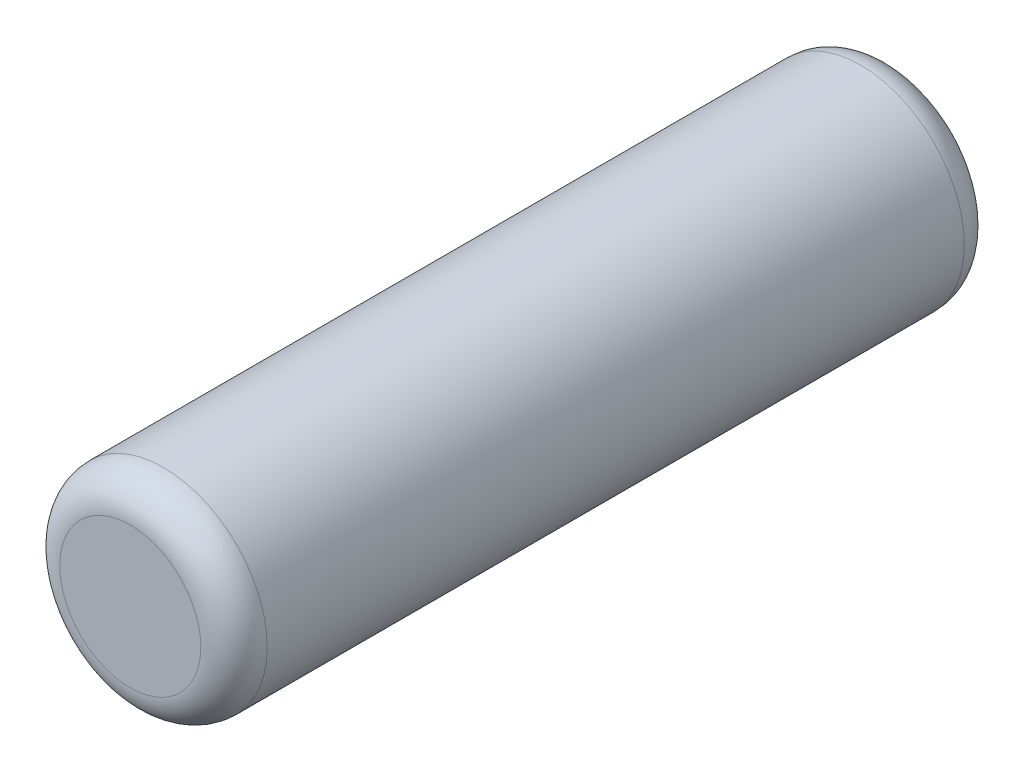
ISO-10303-21;
HEADER;
FILE_DESCRIPTION(('STEP AP214'),'2;1');
FILE_NAME('part.step','',(''),(''),'','','');
FILE_SCHEMA(('AUTOMOTIVE_DESIGN { 1 0 10303 214 1 1 1 1 }'));
ENDSEC;
DATA;
#1=APPLICATION_CONTEXT('core data for automotive mechanical design processes');
#2=APPLICATION_PROTOCOL_DEFINITION('international standard','automotive_design',2000,#1);
#3=PRODUCT_CONTEXT('',#1,'mechanical');
#4=PRODUCT('Part','Part','',(#3));
#5=PRODUCT_RELATED_PRODUCT_CATEGORY('part','',(#4));
#6=PRODUCT_DEFINITION_FORMATION('','',#4);
#7=PRODUCT_DEFINITION_CONTEXT('part definition',#1,'design');
#8=PRODUCT_DEFINITION('design','',#6,#7);
#9=PRODUCT_DEFINITION_SHAPE('','',#8);
#10=(LENGTH_UNIT() NAMED_UNIT(*) SI_UNIT(.MILLI.,.METRE.));
#11=(NAMED_UNIT(*) PLANE_ANGLE_UNIT() SI_UNIT($,.RADIAN.));
#12=(NAMED_UNIT(*) SI_UNIT($,.STERADIAN.) SOLID_ANGLE_UNIT());
#13=UNCERTAINTY_MEASURE_WITH_UNIT(LENGTH_MEASURE(1.E-05),#10,'distance_accuracy_value','');
#14=(GEOMETRIC_REPRESENTATION_CONTEXT(3) GLOBAL_UNCERTAINTY_ASSIGNED_CONTEXT((#13)) GLOBAL_UNIT_ASSIGNED_CONTEXT((#10,
#11,#12)) REPRESENTATION_CONTEXT('',''));
#15=CARTESIAN_POINT('',(0.,0.,0.));
#16=DIRECTION('',(0.,0.,1.));
#17=DIRECTION('',(1.,0.,0.));
#18=AXIS2_PLACEMENT_3D('',#15,#16,#17);
#19=CARTESIAN_POINT('',(0.,0.,23.));
#20=DIRECTION('',(0.,0.,-1.));
#21=DIRECTION('',(-1.,0.,0.));
#22=AXIS2_PLACEMENT_3D('',#19,#20,#21);
#23=CYLINDRICAL_SURFACE('',#22,6.25);
#24=CARTESIAN_POINT('',(0.,0.,-21.));
#25=DIRECTION('',(0.,0.,1.));
#26=DIRECTION('',(1.,0.,0.));
#27=AXIS2_PLACEMENT_3D('',#24,#25,#26);
#28=CIRCLE('',#27,6.25);
#29=CARTESIAN_POINT('',(6.25,0.,-21.));
#30=VERTEX_POINT('',#29);
#31=EDGE_CURVE('E46',#30,#30,#28,.T.);
#32=ORIENTED_EDGE('',*,*,#31,.T.);
#33=EDGE_LOOP('',(#32));
#34=FACE_BOUND('',#33,.T.);
#35=CARTESIAN_POINT('',(0.,0.,21.));
#36=DIRECTION('',(0.,0.,1.));
#37=DIRECTION('',(1.,0.,0.));
#38=AXIS2_PLACEMENT_3D('',#35,#36,#37);
#39=CIRCLE('',#38,6.25);
#40=CARTESIAN_POINT('',(6.25,0.,21.));
#41=VERTEX_POINT('',#40);
#42=EDGE_CURVE('E50',#41,#41,#39,.F.);
#43=ORIENTED_EDGE('',*,*,#42,.T.);
#44=EDGE_LOOP('',(#43));
#45=FACE_BOUND('',#44,.T.);
#46=ADVANCED_FACE('F35',(#34,#45),#23,.T.);
#47=CARTESIAN_POINT('',(0.,0.,23.));
#48=DIRECTION('',(0.,0.,1.));
#49=DIRECTION('',(1.,0.,0.));
#50=AXIS2_PLACEMENT_3D('',#47,#48,#49);
#51=PLANE('',#50);
#52=CARTESIAN_POINT('',(0.,0.,23.));
#53=DIRECTION('',(0.,0.,1.));
#54=DIRECTION('',(1.,0.,0.));
#55=AXIS2_PLACEMENT_3D('',#52,#53,#54);
#56=CIRCLE('',#55,4.25);
#57=CARTESIAN_POINT('',(4.25,0.,23.));
#58=VERTEX_POINT('',#57);
#59=EDGE_CURVE('E10',#58,#58,#56,.T.);
#60=ORIENTED_EDGE('',*,*,#59,.T.);
#61=EDGE_LOOP('',(#60));
#62=FACE_BOUND('',#61,.T.);
#63=ADVANCED_FACE('F66',(#62),#51,.T.);
#64=CARTESIAN_POINT('',(0.,0.,-23.));
#65=DIRECTION('',(0.,0.,1.));
#66=DIRECTION('',(1.,0.,0.));
#67=AXIS2_PLACEMENT_3D('',#64,#65,#66);
#68=PLANE('',#67);
#69=CARTESIAN_POINT('',(0.,0.,-23.));
#70=DIRECTION('',(0.,0.,1.));
#71=DIRECTION('',(1.,0.,0.));
#72=AXIS2_PLACEMENT_3D('',#69,#70,#71);
#73=CIRCLE('',#72,4.25);
#74=CARTESIAN_POINT('',(4.25,0.,-23.));
#75=VERTEX_POINT('',#74);
#76=EDGE_CURVE('E42',#75,#75,#73,.F.);
#77=ORIENTED_EDGE('',*,*,#76,.T.);
#78=EDGE_LOOP('',(#77));
#79=FACE_BOUND('',#78,.T.);
#80=ADVANCED_FACE('F63',(#79),#68,.F.);
#81=CARTESIAN_POINT('',(0.,0.,-21.));
#82=DIRECTION('',(0.,0.,1.));
#83=DIRECTION('',(1.,0.,0.));
#84=AXIS2_PLACEMENT_3D('',#81,#82,#83);
#85=TOROIDAL_SURFACE('',#84,4.25,2.);
#86=ORIENTED_EDGE('',*,*,#76,.F.);
#87=EDGE_LOOP('',(#86));
#88=FACE_BOUND('',#87,.T.);
#89=ORIENTED_EDGE('',*,*,#31,.F.);
#90=EDGE_LOOP('',(#89));
#91=FACE_BOUND('',#90,.T.);
#92=ADVANCED_FACE('F59',(#88,#91),#85,.T.);
#93=CARTESIAN_POINT('',(0.,0.,21.));
#94=DIRECTION('',(0.,0.,1.));
#95=DIRECTION('',(1.,0.,0.));
#96=AXIS2_PLACEMENT_3D('',#93,#94,#95);
#97=TOROIDAL_SURFACE('',#96,4.25,2.);
#98=ORIENTED_EDGE('',*,*,#42,.F.);
#99=EDGE_LOOP('',(#98));
#100=FACE_BOUND('',#99,.T.);
#101=ORIENTED_EDGE('',*,*,#59,.F.);
#102=EDGE_LOOP('',(#101));
#103=FACE_BOUND('',#102,.T.);
#104=ADVANCED_FACE('F37',(#100,#103),#97,.T.);
#105=CLOSED_SHELL('',(#46,#63,#80,#92,#104));
#106=MANIFOLD_SOLID_BREP('B2',#105);
#107=ADVANCED_BREP_SHAPE_REPRESENTATION('',(#18,#106),#14);
#108=SHAPE_DEFINITION_REPRESENTATION(#9,#107);
ENDSEC;
END-ISO-10303-21;
